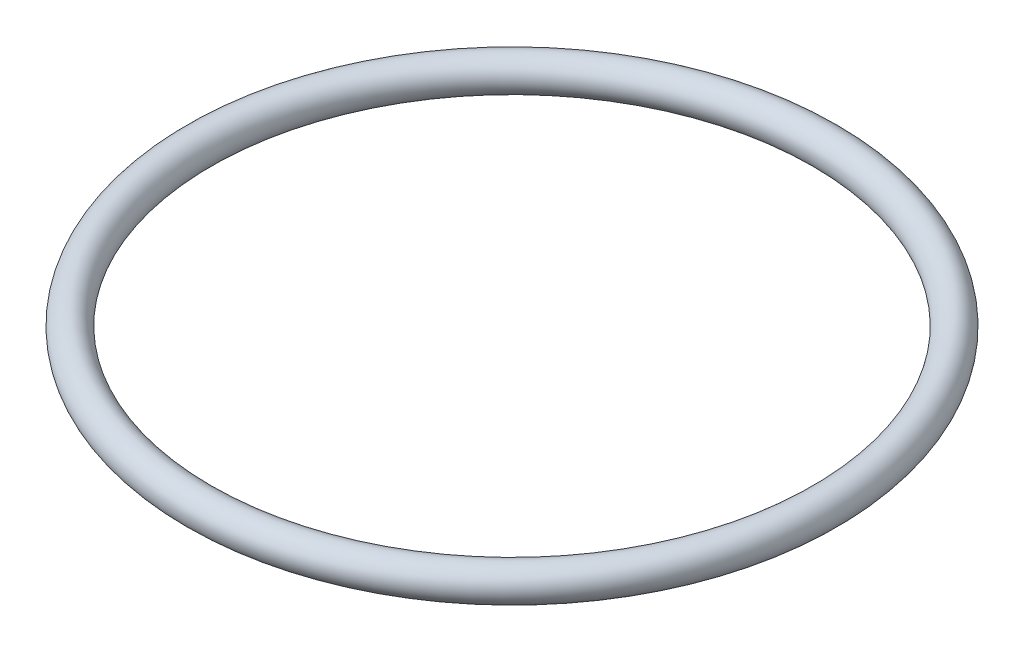
ISO-10303-21;
HEADER;
FILE_DESCRIPTION(('STEP AP214'),'2;1');
FILE_NAME('part.step','',(''),(''),'','','');
FILE_SCHEMA(('AUTOMOTIVE_DESIGN { 1 0 10303 214 1 1 1 1 }'));
ENDSEC;
DATA;
#1=APPLICATION_CONTEXT('core data for automotive mechanical design processes');
#2=APPLICATION_PROTOCOL_DEFINITION('international standard','automotive_design',2000,#1);
#3=PRODUCT_CONTEXT('',#1,'mechanical');
#4=PRODUCT('Part','Part','',(#3));
#5=PRODUCT_RELATED_PRODUCT_CATEGORY('part','',(#4));
#6=PRODUCT_DEFINITION_FORMATION('','',#4);
#7=PRODUCT_DEFINITION_CONTEXT('part definition',#1,'design');
#8=PRODUCT_DEFINITION('design','',#6,#7);
#9=PRODUCT_DEFINITION_SHAPE('','',#8);
#10=(LENGTH_UNIT() NAMED_UNIT(*) SI_UNIT(.MILLI.,.METRE.));
#11=(NAMED_UNIT(*) PLANE_ANGLE_UNIT() SI_UNIT($,.RADIAN.));
#12=(NAMED_UNIT(*) SI_UNIT($,.STERADIAN.) SOLID_ANGLE_UNIT());
#13=UNCERTAINTY_MEASURE_WITH_UNIT(LENGTH_MEASURE(1.E-05),#10,'distance_accuracy_value','');
#14=(GEOMETRIC_REPRESENTATION_CONTEXT(3) GLOBAL_UNCERTAINTY_ASSIGNED_CONTEXT((#13)) GLOBAL_UNIT_ASSIGNED_CONTEXT((#10,
#11,#12)) REPRESENTATION_CONTEXT('',''));
#15=CARTESIAN_POINT('',(0.,0.,0.));
#16=DIRECTION('',(0.,0.,1.));
#17=DIRECTION('',(1.,0.,0.));
#18=AXIS2_PLACEMENT_3D('',#15,#16,#17);
#19=CARTESIAN_POINT('',(0.,0.,0.));
#20=DIRECTION('',(0.,-1.,0.));
#21=DIRECTION('',(0.,0.,-1.));
#22=AXIS2_PLACEMENT_3D('',#19,#20,#21);
#23=TOROIDAL_SURFACE('',#22,18.5,1.);
#24=CARTESIAN_POINT('',(0.,0.,-19.5));
#25=VERTEX_POINT('',#24);
#26=VERTEX_LOOP('',#25);
#27=FACE_BOUND('',#26,.T.);
#28=ADVANCED_FACE('F33',(#27),#23,.T.);
#29=CLOSED_SHELL('',(#28));
#30=MANIFOLD_SOLID_BREP('B2',#29);
#31=ADVANCED_BREP_SHAPE_REPRESENTATION('',(#18,#30),#14);
#32=SHAPE_DEFINITION_REPRESENTATION(#9,#31);
ENDSEC;
END-ISO-10303-21;
